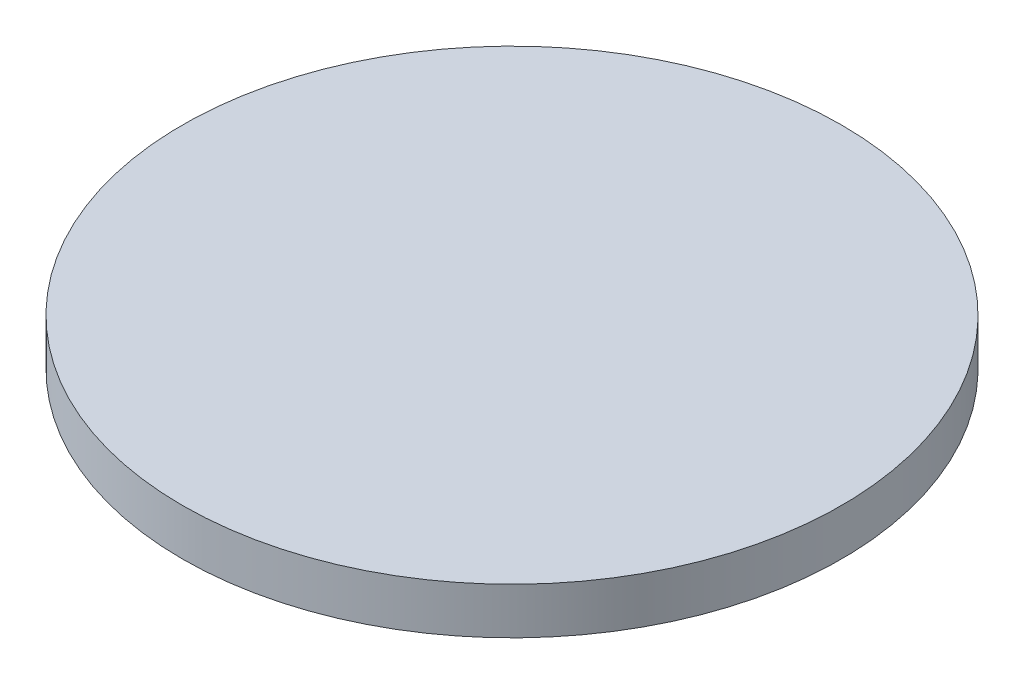
ISO-10303-21;
HEADER;
FILE_DESCRIPTION(('STEP AP214'),'2;1');
FILE_NAME('part.step','',(''),(''),'','','');
FILE_SCHEMA(('AUTOMOTIVE_DESIGN { 1 0 10303 214 1 1 1 1 }'));
ENDSEC;
DATA;
#1=APPLICATION_CONTEXT('core data for automotive mechanical design processes');
#2=APPLICATION_PROTOCOL_DEFINITION('international standard','automotive_design',2000,#1);
#3=PRODUCT_CONTEXT('',#1,'mechanical');
#4=PRODUCT('Part','Part','',(#3));
#5=PRODUCT_RELATED_PRODUCT_CATEGORY('part','',(#4));
#6=PRODUCT_DEFINITION_FORMATION('','',#4);
#7=PRODUCT_DEFINITION_CONTEXT('part definition',#1,'design');
#8=PRODUCT_DEFINITION('design','',#6,#7);
#9=PRODUCT_DEFINITION_SHAPE('','',#8);
#10=(LENGTH_UNIT() NAMED_UNIT(*) SI_UNIT(.MILLI.,.METRE.));
#11=(NAMED_UNIT(*) PLANE_ANGLE_UNIT() SI_UNIT($,.RADIAN.));
#12=(NAMED_UNIT(*) SI_UNIT($,.STERADIAN.) SOLID_ANGLE_UNIT());
#13=UNCERTAINTY_MEASURE_WITH_UNIT(LENGTH_MEASURE(1.E-05),#10,'distance_accuracy_value','');
#14=(GEOMETRIC_REPRESENTATION_CONTEXT(3) GLOBAL_UNCERTAINTY_ASSIGNED_CONTEXT((#13)) GLOBAL_UNIT_ASSIGNED_CONTEXT((#10,
#11,#12)) REPRESENTATION_CONTEXT('',''));
#15=CARTESIAN_POINT('',(0.,0.,0.));
#16=DIRECTION('',(0.,0.,1.));
#17=DIRECTION('',(1.,0.,0.));
#18=AXIS2_PLACEMENT_3D('',#15,#16,#17);
#19=CARTESIAN_POINT('',(16.,27.4,-22.5));
#20=DIRECTION('',(0.,1.,0.));
#21=DIRECTION('',(0.,0.,1.));
#22=AXIS2_PLACEMENT_3D('',#19,#20,#21);
#23=CYLINDRICAL_SURFACE('',#22,7.1);
#24=CARTESIAN_POINT('',(16.,27.4,-22.5));
#25=DIRECTION('',(0.,1.,0.));
#26=DIRECTION('',(0.,0.,1.));
#27=AXIS2_PLACEMENT_3D('',#24,#25,#26);
#28=CIRCLE('',#27,7.1);
#29=CARTESIAN_POINT('',(16.,27.4,-15.4));
#30=VERTEX_POINT('',#29);
#31=EDGE_CURVE('E11',#30,#30,#28,.T.);
#32=ORIENTED_EDGE('',*,*,#31,.T.);
#33=EDGE_LOOP('',(#32));
#34=FACE_BOUND('',#33,.T.);
#35=CARTESIAN_POINT('',(16.,28.4,-22.5));
#36=DIRECTION('',(0.,1.,0.));
#37=DIRECTION('',(0.,0.,1.));
#38=AXIS2_PLACEMENT_3D('',#35,#36,#37);
#39=CIRCLE('',#38,7.1);
#40=CARTESIAN_POINT('',(16.,28.4,-15.4));
#41=VERTEX_POINT('',#40);
#42=EDGE_CURVE('E45',#41,#41,#39,.T.);
#43=ORIENTED_EDGE('',*,*,#42,.F.);
#44=EDGE_LOOP('',(#43));
#45=FACE_BOUND('',#44,.T.);
#46=ADVANCED_FACE('F39',(#34,#45),#23,.T.);
#47=CARTESIAN_POINT('',(16.,27.4,-22.5));
#48=DIRECTION('',(0.,1.,0.));
#49=DIRECTION('',(0.,0.,1.));
#50=AXIS2_PLACEMENT_3D('',#47,#48,#49);
#51=PLANE('',#50);
#52=DIRECTION('',(-1.,0.,0.));
#53=VECTOR('',#52,1.);
#54=CARTESIAN_POINT('',(13.64,27.4,-24.38));
#55=LINE('',#54,#53);
#56=CARTESIAN_POINT('',(18.36,27.4,-24.38));
#57=VERTEX_POINT('',#56);
#58=CARTESIAN_POINT('',(13.64,27.4,-24.38));
#59=VERTEX_POINT('',#58);
#60=EDGE_CURVE('E103',#57,#59,#55,.T.);
#61=ORIENTED_EDGE('',*,*,#60,.T.);
#62=DIRECTION('',(0.,0.,1.));
#63=VECTOR('',#62,1.);
#64=CARTESIAN_POINT('',(13.64,27.4,-20.62));
#65=LINE('',#64,#63);
#66=CARTESIAN_POINT('',(13.64,27.4,-20.62));
#67=VERTEX_POINT('',#66);
#68=EDGE_CURVE('E52',#59,#67,#65,.T.);
#69=ORIENTED_EDGE('',*,*,#68,.T.);
#70=DIRECTION('',(1.,0.,0.));
#71=VECTOR('',#70,1.);
#72=CARTESIAN_POINT('',(18.36,27.4,-20.62));
#73=LINE('',#72,#71);
#74=CARTESIAN_POINT('',(18.36,27.4,-20.62));
#75=VERTEX_POINT('',#74);
#76=EDGE_CURVE('E107',#67,#75,#73,.T.);
#77=ORIENTED_EDGE('',*,*,#76,.T.);
#78=DIRECTION('',(0.,0.,-1.));
#79=VECTOR('',#78,1.);
#80=CARTESIAN_POINT('',(18.36,27.4,-24.38));
#81=LINE('',#80,#79);
#82=EDGE_CURVE('E93',#75,#57,#81,.T.);
#83=ORIENTED_EDGE('',*,*,#82,.T.);
#84=EDGE_LOOP('',(#61,#69,#77,#83));
#85=FACE_BOUND('',#84,.T.);
#86=ORIENTED_EDGE('',*,*,#31,.F.);
#87=EDGE_LOOP('',(#86));
#88=FACE_BOUND('',#87,.T.);
#89=ADVANCED_FACE('F120',(#85,#88),#51,.F.);
#90=CARTESIAN_POINT('',(16.,28.4,-22.5));
#91=DIRECTION('',(0.,1.,0.));
#92=DIRECTION('',(0.,0.,1.));
#93=AXIS2_PLACEMENT_3D('',#90,#91,#92);
#94=PLANE('',#93);
#95=ORIENTED_EDGE('',*,*,#42,.T.);
#96=EDGE_LOOP('',(#95));
#97=FACE_BOUND('',#96,.T.);
#98=ADVANCED_FACE('F126',(#97),#94,.T.);
#99=CARTESIAN_POINT('',(13.64,26.3,-20.62));
#100=DIRECTION('',(-1.,0.,0.));
#101=DIRECTION('',(0.,0.,1.));
#102=AXIS2_PLACEMENT_3D('',#99,#100,#101);
#103=PLANE('',#102);
#104=ORIENTED_EDGE('',*,*,#68,.F.);
#105=DIRECTION('',(0.,1.,0.));
#106=VECTOR('',#105,1.);
#107=CARTESIAN_POINT('',(13.64,26.3,-24.38));
#108=LINE('',#107,#106);
#109=CARTESIAN_POINT('',(13.64,26.3,-24.38));
#110=VERTEX_POINT('',#109);
#111=EDGE_CURVE('E59',#110,#59,#108,.T.);
#112=ORIENTED_EDGE('',*,*,#111,.F.);
#113=DIRECTION('',(0.,0.,1.));
#114=VECTOR('',#113,1.);
#115=CARTESIAN_POINT('',(13.64,26.3,-20.62));
#116=LINE('',#115,#114);
#117=CARTESIAN_POINT('',(13.64,26.3,-20.62));
#118=VERTEX_POINT('',#117);
#119=EDGE_CURVE('E101',#110,#118,#116,.T.);
#120=ORIENTED_EDGE('',*,*,#119,.T.);
#121=DIRECTION('',(0.,1.,0.));
#122=VECTOR('',#121,1.);
#123=CARTESIAN_POINT('',(13.64,26.3,-20.62));
#124=LINE('',#123,#122);
#125=EDGE_CURVE('E85',#118,#67,#124,.T.);
#126=ORIENTED_EDGE('',*,*,#125,.T.);
#127=EDGE_LOOP('',(#104,#112,#120,#126));
#128=FACE_BOUND('',#127,.T.);
#129=ADVANCED_FACE('F113',(#128),#103,.T.);
#130=CARTESIAN_POINT('',(13.64,26.3,-24.38));
#131=DIRECTION('',(0.,0.,-1.));
#132=DIRECTION('',(-1.,0.,0.));
#133=AXIS2_PLACEMENT_3D('',#130,#131,#132);
#134=PLANE('',#133);
#135=ORIENTED_EDGE('',*,*,#60,.F.);
#136=DIRECTION('',(0.,1.,0.));
#137=VECTOR('',#136,1.);
#138=CARTESIAN_POINT('',(18.36,26.3,-24.38));
#139=LINE('',#138,#137);
#140=CARTESIAN_POINT('',(18.36,26.3,-24.38));
#141=VERTEX_POINT('',#140);
#142=EDGE_CURVE('E73',#141,#57,#139,.T.);
#143=ORIENTED_EDGE('',*,*,#142,.F.);
#144=DIRECTION('',(-1.,0.,0.));
#145=VECTOR('',#144,1.);
#146=CARTESIAN_POINT('',(13.64,26.3,-24.38));
#147=LINE('',#146,#145);
#148=EDGE_CURVE('E98',#141,#110,#147,.T.);
#149=ORIENTED_EDGE('',*,*,#148,.T.);
#150=ORIENTED_EDGE('',*,*,#111,.T.);
#151=EDGE_LOOP('',(#135,#143,#149,#150));
#152=FACE_BOUND('',#151,.T.);
#153=ADVANCED_FACE('F118',(#152),#134,.T.);
#154=CARTESIAN_POINT('',(18.36,26.3,-24.38));
#155=DIRECTION('',(1.,0.,0.));
#156=DIRECTION('',(0.,0.,-1.));
#157=AXIS2_PLACEMENT_3D('',#154,#155,#156);
#158=PLANE('',#157);
#159=ORIENTED_EDGE('',*,*,#82,.F.);
#160=DIRECTION('',(0.,1.,0.));
#161=VECTOR('',#160,1.);
#162=CARTESIAN_POINT('',(18.36,26.3,-20.62));
#163=LINE('',#162,#161);
#164=CARTESIAN_POINT('',(18.36,26.3,-20.62));
#165=VERTEX_POINT('',#164);
#166=EDGE_CURVE('E84',#165,#75,#163,.T.);
#167=ORIENTED_EDGE('',*,*,#166,.F.);
#168=DIRECTION('',(0.,0.,-1.));
#169=VECTOR('',#168,1.);
#170=CARTESIAN_POINT('',(18.36,26.3,-24.38));
#171=LINE('',#170,#169);
#172=EDGE_CURVE('E86',#165,#141,#171,.T.);
#173=ORIENTED_EDGE('',*,*,#172,.T.);
#174=ORIENTED_EDGE('',*,*,#142,.T.);
#175=EDGE_LOOP('',(#159,#167,#173,#174));
#176=FACE_BOUND('',#175,.T.);
#177=ADVANCED_FACE('F87',(#176),#158,.T.);
#178=CARTESIAN_POINT('',(18.36,26.3,-20.62));
#179=DIRECTION('',(0.,0.,1.));
#180=DIRECTION('',(1.,0.,0.));
#181=AXIS2_PLACEMENT_3D('',#178,#179,#180);
#182=PLANE('',#181);
#183=ORIENTED_EDGE('',*,*,#76,.F.);
#184=ORIENTED_EDGE('',*,*,#125,.F.);
#185=DIRECTION('',(1.,0.,0.));
#186=VECTOR('',#185,1.);
#187=CARTESIAN_POINT('',(18.36,26.3,-20.62));
#188=LINE('',#187,#186);
#189=EDGE_CURVE('E96',#118,#165,#188,.T.);
#190=ORIENTED_EDGE('',*,*,#189,.T.);
#191=ORIENTED_EDGE('',*,*,#166,.T.);
#192=EDGE_LOOP('',(#183,#184,#190,#191));
#193=FACE_BOUND('',#192,.T.);
#194=ADVANCED_FACE('F99',(#193),#182,.T.);
#195=CARTESIAN_POINT('',(0.,26.3,0.));
#196=DIRECTION('',(0.,-1.,0.));
#197=DIRECTION('',(0.,0.,-1.));
#198=AXIS2_PLACEMENT_3D('',#195,#196,#197);
#199=PLANE('',#198);
#200=ORIENTED_EDGE('',*,*,#119,.F.);
#201=ORIENTED_EDGE('',*,*,#148,.F.);
#202=ORIENTED_EDGE('',*,*,#172,.F.);
#203=ORIENTED_EDGE('',*,*,#189,.F.);
#204=EDGE_LOOP('',(#200,#201,#202,#203));
#205=FACE_BOUND('',#204,.T.);
#206=ADVANCED_FACE('F92',(#205),#199,.T.);
#207=CLOSED_SHELL('',(#46,#89,#98,#129,#153,#177,#194,#206));
#208=MANIFOLD_SOLID_BREP('B2',#207);
#209=ADVANCED_BREP_SHAPE_REPRESENTATION('',(#18,#208),#14);
#210=SHAPE_DEFINITION_REPRESENTATION(#9,#209);
ENDSEC;
END-ISO-10303-21;
